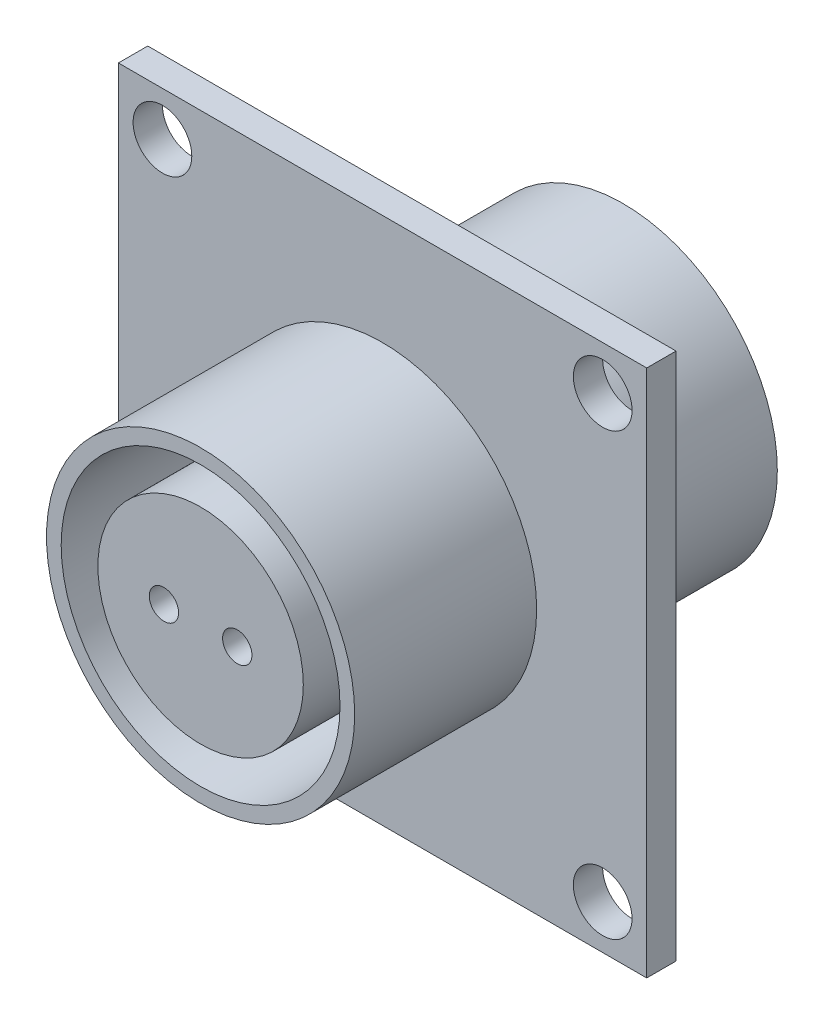
ISO-10303-21;
HEADER;
FILE_DESCRIPTION(('STEP AP214'),'2;1');
FILE_NAME('part.step','',(''),(''),'','','');
FILE_SCHEMA(('AUTOMOTIVE_DESIGN { 1 0 10303 214 1 1 1 1 }'));
ENDSEC;
DATA;
#1=APPLICATION_CONTEXT('core data for automotive mechanical design processes');
#2=APPLICATION_PROTOCOL_DEFINITION('international standard','automotive_design',2000,#1);
#3=PRODUCT_CONTEXT('',#1,'mechanical');
#4=PRODUCT('Part','Part','',(#3));
#5=PRODUCT_RELATED_PRODUCT_CATEGORY('part','',(#4));
#6=PRODUCT_DEFINITION_FORMATION('','',#4);
#7=PRODUCT_DEFINITION_CONTEXT('part definition',#1,'design');
#8=PRODUCT_DEFINITION('design','',#6,#7);
#9=PRODUCT_DEFINITION_SHAPE('','',#8);
#10=(LENGTH_UNIT() NAMED_UNIT(*) SI_UNIT(.MILLI.,.METRE.));
#11=(NAMED_UNIT(*) PLANE_ANGLE_UNIT() SI_UNIT($,.RADIAN.));
#12=(NAMED_UNIT(*) SI_UNIT($,.STERADIAN.) SOLID_ANGLE_UNIT());
#13=UNCERTAINTY_MEASURE_WITH_UNIT(LENGTH_MEASURE(1.E-05),#10,'distance_accuracy_value','');
#14=(GEOMETRIC_REPRESENTATION_CONTEXT(3) GLOBAL_UNCERTAINTY_ASSIGNED_CONTEXT((#13)) GLOBAL_UNIT_ASSIGNED_CONTEXT((#10,
#11,#12)) REPRESENTATION_CONTEXT('',''));
#15=CARTESIAN_POINT('',(0.,0.,0.));
#16=DIRECTION('',(0.,0.,1.));
#17=DIRECTION('',(1.,0.,0.));
#18=AXIS2_PLACEMENT_3D('',#15,#16,#17);
#19=CARTESIAN_POINT('',(15.,-15.,14.4));
#20=DIRECTION('',(0.,0.,1.));
#21=DIRECTION('',(1.,0.,0.));
#22=AXIS2_PLACEMENT_3D('',#19,#20,#21);
#23=PLANE('',#22);
#24=CARTESIAN_POINT('',(15.,-15.,14.4));
#25=DIRECTION('',(0.,0.,1.));
#26=DIRECTION('',(1.,0.,0.));
#27=AXIS2_PLACEMENT_3D('',#24,#25,#26);
#28=CIRCLE('',#27,7.);
#29=CARTESIAN_POINT('',(22.,-15.,14.4));
#30=VERTEX_POINT('',#29);
#31=EDGE_CURVE('E224',#30,#30,#28,.T.);
#32=ORIENTED_EDGE('',*,*,#31,.T.);
#33=EDGE_LOOP('',(#32));
#34=FACE_BOUND('',#33,.T.);
#35=CARTESIAN_POINT('',(17.5,-15.,14.4));
#36=DIRECTION('',(0.,0.,1.));
#37=DIRECTION('',(1.,0.,0.));
#38=AXIS2_PLACEMENT_3D('',#35,#36,#37);
#39=CIRCLE('',#38,1.);
#40=CARTESIAN_POINT('',(18.5,-15.,14.4));
#41=VERTEX_POINT('',#40);
#42=EDGE_CURVE('E229',#41,#41,#39,.T.);
#43=ORIENTED_EDGE('',*,*,#42,.F.);
#44=EDGE_LOOP('',(#43));
#45=FACE_BOUND('',#44,.T.);
#46=CARTESIAN_POINT('',(12.5,-15.,14.4));
#47=DIRECTION('',(0.,0.,1.));
#48=DIRECTION('',(1.,0.,0.));
#49=AXIS2_PLACEMENT_3D('',#46,#47,#48);
#50=CIRCLE('',#49,1.);
#51=CARTESIAN_POINT('',(13.5,-15.,14.4));
#52=VERTEX_POINT('',#51);
#53=EDGE_CURVE('E235',#52,#52,#50,.F.);
#54=ORIENTED_EDGE('',*,*,#53,.T.);
#55=EDGE_LOOP('',(#54));
#56=FACE_BOUND('',#55,.T.);
#57=ADVANCED_FACE('F49',(#34,#45,#56),#23,.T.);
#58=CARTESIAN_POINT('',(0.,0.,2.));
#59=DIRECTION('',(0.,0.,1.));
#60=DIRECTION('',(1.,0.,0.));
#61=AXIS2_PLACEMENT_3D('',#58,#59,#60);
#62=PLANE('',#61);
#63=CARTESIAN_POINT('',(15.,-15.,2.));
#64=DIRECTION('',(0.,0.,1.));
#65=DIRECTION('',(1.,0.,0.));
#66=AXIS2_PLACEMENT_3D('',#63,#64,#65);
#67=CIRCLE('',#66,10.5);
#68=CARTESIAN_POINT('',(25.5,-15.,2.));
#69=VERTEX_POINT('',#68);
#70=EDGE_CURVE('E12',#69,#69,#67,.T.);
#71=ORIENTED_EDGE('',*,*,#70,.F.);
#72=EDGE_LOOP('',(#71));
#73=FACE_BOUND('',#72,.T.);
#74=CARTESIAN_POINT('',(4.30211422042248E-13,-30.0000000000002,2.));
#75=DIRECTION('',(0.,0.,1.));
#76=DIRECTION('',(1.,0.,0.));
#77=AXIS2_PLACEMENT_3D('',#74,#75,#76);
#78=CIRCLE('',#77,2.);
#79=CARTESIAN_POINT('',(2.00000000000043,-30.0000000000002,2.));
#80=VERTEX_POINT('',#79);
#81=EDGE_CURVE('E151',#80,#80,#78,.T.);
#82=ORIENTED_EDGE('',*,*,#81,.F.);
#83=EDGE_LOOP('',(#82));
#84=FACE_BOUND('',#83,.T.);
#85=CARTESIAN_POINT('',(30.0000000000001,0.,2.));
#86=DIRECTION('',(0.,0.,1.));
#87=DIRECTION('',(1.,0.,0.));
#88=AXIS2_PLACEMENT_3D('',#85,#86,#87);
#89=CIRCLE('',#88,2.);
#90=CARTESIAN_POINT('',(32.0000000000001,0.,2.));
#91=VERTEX_POINT('',#90);
#92=EDGE_CURVE('E122',#91,#91,#89,.T.);
#93=ORIENTED_EDGE('',*,*,#92,.F.);
#94=EDGE_LOOP('',(#93));
#95=FACE_BOUND('',#94,.T.);
#96=DIRECTION('',(0.,-1.,0.));
#97=VECTOR('',#96,1.);
#98=CARTESIAN_POINT('',(-3.,3.,2.));
#99=LINE('',#98,#97);
#100=CARTESIAN_POINT('',(-3.,3.,2.));
#101=VERTEX_POINT('',#100);
#102=CARTESIAN_POINT('',(-3.,-33.,2.));
#103=VERTEX_POINT('',#102);
#104=EDGE_CURVE('E105',#101,#103,#99,.T.);
#105=ORIENTED_EDGE('',*,*,#104,.T.);
#106=DIRECTION('',(1.,0.,0.));
#107=VECTOR('',#106,1.);
#108=CARTESIAN_POINT('',(-3.,-33.,2.));
#109=LINE('',#108,#107);
#110=CARTESIAN_POINT('',(33.,-33.,2.));
#111=VERTEX_POINT('',#110);
#112=EDGE_CURVE('E99',#103,#111,#109,.T.);
#113=ORIENTED_EDGE('',*,*,#112,.T.);
#114=DIRECTION('',(0.,1.,0.));
#115=VECTOR('',#114,1.);
#116=CARTESIAN_POINT('',(33.,3.,2.));
#117=LINE('',#116,#115);
#118=CARTESIAN_POINT('',(33.,3.,2.));
#119=VERTEX_POINT('',#118);
#120=EDGE_CURVE('E103',#111,#119,#117,.T.);
#121=ORIENTED_EDGE('',*,*,#120,.T.);
#122=DIRECTION('',(-1.,0.,0.));
#123=VECTOR('',#122,1.);
#124=CARTESIAN_POINT('',(-3.,3.,2.));
#125=LINE('',#124,#123);
#126=EDGE_CURVE('E68',#119,#101,#125,.T.);
#127=ORIENTED_EDGE('',*,*,#126,.T.);
#128=EDGE_LOOP('',(#105,#113,#121,#127));
#129=FACE_BOUND('',#128,.T.);
#130=CARTESIAN_POINT('',(1.14491749414469E-13,-2.09488880330588E-13,2.));
#131=DIRECTION('',(0.,0.,1.));
#132=DIRECTION('',(1.,0.,0.));
#133=AXIS2_PLACEMENT_3D('',#130,#131,#132);
#134=CIRCLE('',#133,2.);
#135=CARTESIAN_POINT('',(2.00000000000011,-2.09488880330588E-13,2.));
#136=VERTEX_POINT('',#135);
#137=EDGE_CURVE('E156',#136,#136,#134,.T.);
#138=ORIENTED_EDGE('',*,*,#137,.F.);
#139=EDGE_LOOP('',(#138));
#140=FACE_BOUND('',#139,.T.);
#141=CARTESIAN_POINT('',(30.0000000000004,-30.,2.));
#142=DIRECTION('',(0.,0.,1.));
#143=DIRECTION('',(1.,0.,0.));
#144=AXIS2_PLACEMENT_3D('',#141,#142,#143);
#145=CIRCLE('',#144,2.);
#146=CARTESIAN_POINT('',(32.0000000000004,-30.,2.));
#147=VERTEX_POINT('',#146);
#148=EDGE_CURVE('E143',#147,#147,#145,.T.);
#149=ORIENTED_EDGE('',*,*,#148,.F.);
#150=EDGE_LOOP('',(#149));
#151=FACE_BOUND('',#150,.T.);
#152=ADVANCED_FACE('F100',(#73,#84,#95,#129,#140,#151),#62,.T.);
#153=CARTESIAN_POINT('',(0.,0.,0.));
#154=DIRECTION('',(0.,0.,1.));
#155=DIRECTION('',(1.,0.,0.));
#156=AXIS2_PLACEMENT_3D('',#153,#154,#155);
#157=PLANE('',#156);
#158=CARTESIAN_POINT('',(15.,-15.,0.));
#159=DIRECTION('',(0.,0.,1.));
#160=DIRECTION('',(1.,0.,0.));
#161=AXIS2_PLACEMENT_3D('',#158,#159,#160);
#162=CIRCLE('',#161,10.5);
#163=CARTESIAN_POINT('',(25.5,-15.,0.));
#164=VERTEX_POINT('',#163);
#165=EDGE_CURVE('E53',#164,#164,#162,.T.);
#166=ORIENTED_EDGE('',*,*,#165,.T.);
#167=EDGE_LOOP('',(#166));
#168=FACE_BOUND('',#167,.T.);
#169=CARTESIAN_POINT('',(4.30211422042248E-13,-30.0000000000002,0.));
#170=DIRECTION('',(0.,0.,1.));
#171=DIRECTION('',(1.,0.,0.));
#172=AXIS2_PLACEMENT_3D('',#169,#170,#171);
#173=CIRCLE('',#172,2.);
#174=CARTESIAN_POINT('',(2.00000000000043,-30.0000000000002,0.));
#175=VERTEX_POINT('',#174);
#176=EDGE_CURVE('E146',#175,#175,#173,.T.);
#177=ORIENTED_EDGE('',*,*,#176,.T.);
#178=EDGE_LOOP('',(#177));
#179=FACE_BOUND('',#178,.T.);
#180=CARTESIAN_POINT('',(30.0000000000001,0.,0.));
#181=DIRECTION('',(0.,0.,1.));
#182=DIRECTION('',(1.,0.,0.));
#183=AXIS2_PLACEMENT_3D('',#180,#181,#182);
#184=CIRCLE('',#183,2.);
#185=CARTESIAN_POINT('',(32.0000000000001,0.,0.));
#186=VERTEX_POINT('',#185);
#187=EDGE_CURVE('E159',#186,#186,#184,.T.);
#188=ORIENTED_EDGE('',*,*,#187,.T.);
#189=EDGE_LOOP('',(#188));
#190=FACE_BOUND('',#189,.T.);
#191=DIRECTION('',(0.,-1.,0.));
#192=VECTOR('',#191,1.);
#193=CARTESIAN_POINT('',(-3.,3.,0.));
#194=LINE('',#193,#192);
#195=CARTESIAN_POINT('',(-3.,3.,0.));
#196=VERTEX_POINT('',#195);
#197=CARTESIAN_POINT('',(-3.,-33.,0.));
#198=VERTEX_POINT('',#197);
#199=EDGE_CURVE('E119',#196,#198,#194,.T.);
#200=ORIENTED_EDGE('',*,*,#199,.F.);
#201=DIRECTION('',(-1.,0.,0.));
#202=VECTOR('',#201,1.);
#203=CARTESIAN_POINT('',(-3.,3.,0.));
#204=LINE('',#203,#202);
#205=CARTESIAN_POINT('',(33.,3.,0.));
#206=VERTEX_POINT('',#205);
#207=EDGE_CURVE('E91',#206,#196,#204,.T.);
#208=ORIENTED_EDGE('',*,*,#207,.F.);
#209=DIRECTION('',(0.,1.,0.));
#210=VECTOR('',#209,1.);
#211=CARTESIAN_POINT('',(33.,3.,0.));
#212=LINE('',#211,#210);
#213=CARTESIAN_POINT('',(33.,-33.,0.));
#214=VERTEX_POINT('',#213);
#215=EDGE_CURVE('E85',#214,#206,#212,.T.);
#216=ORIENTED_EDGE('',*,*,#215,.F.);
#217=DIRECTION('',(1.,0.,0.));
#218=VECTOR('',#217,1.);
#219=CARTESIAN_POINT('',(-3.,-33.,0.));
#220=LINE('',#219,#218);
#221=EDGE_CURVE('E110',#198,#214,#220,.T.);
#222=ORIENTED_EDGE('',*,*,#221,.F.);
#223=EDGE_LOOP('',(#200,#208,#216,#222));
#224=FACE_BOUND('',#223,.T.);
#225=CARTESIAN_POINT('',(1.14491749414469E-13,-2.09488880330588E-13,0.));
#226=DIRECTION('',(0.,0.,1.));
#227=DIRECTION('',(1.,0.,0.));
#228=AXIS2_PLACEMENT_3D('',#225,#226,#227);
#229=CIRCLE('',#228,2.);
#230=CARTESIAN_POINT('',(2.00000000000011,-2.09488880330588E-13,0.));
#231=VERTEX_POINT('',#230);
#232=EDGE_CURVE('E138',#231,#231,#229,.T.);
#233=ORIENTED_EDGE('',*,*,#232,.T.);
#234=EDGE_LOOP('',(#233));
#235=FACE_BOUND('',#234,.T.);
#236=CARTESIAN_POINT('',(30.0000000000004,-30.,0.));
#237=DIRECTION('',(0.,0.,1.));
#238=DIRECTION('',(1.,0.,0.));
#239=AXIS2_PLACEMENT_3D('',#236,#237,#238);
#240=CIRCLE('',#239,2.);
#241=CARTESIAN_POINT('',(32.0000000000004,-30.,0.));
#242=VERTEX_POINT('',#241);
#243=EDGE_CURVE('E141',#242,#242,#240,.T.);
#244=ORIENTED_EDGE('',*,*,#243,.T.);
#245=EDGE_LOOP('',(#244));
#246=FACE_BOUND('',#245,.T.);
#247=ADVANCED_FACE('F130',(#168,#179,#190,#224,#235,#246),#157,.F.);
#248=CARTESIAN_POINT('',(-3.,3.,2.));
#249=DIRECTION('',(1.,0.,0.));
#250=DIRECTION('',(0.,0.,-1.));
#251=AXIS2_PLACEMENT_3D('',#248,#249,#250);
#252=PLANE('',#251);
#253=ORIENTED_EDGE('',*,*,#199,.T.);
#254=DIRECTION('',(0.,0.,-1.));
#255=VECTOR('',#254,1.);
#256=CARTESIAN_POINT('',(-3.,-33.,2.));
#257=LINE('',#256,#255);
#258=EDGE_CURVE('E59',#103,#198,#257,.T.);
#259=ORIENTED_EDGE('',*,*,#258,.F.);
#260=ORIENTED_EDGE('',*,*,#104,.F.);
#261=DIRECTION('',(0.,0.,-1.));
#262=VECTOR('',#261,1.);
#263=CARTESIAN_POINT('',(-3.,3.,2.));
#264=LINE('',#263,#262);
#265=EDGE_CURVE('E115',#101,#196,#264,.T.);
#266=ORIENTED_EDGE('',*,*,#265,.T.);
#267=EDGE_LOOP('',(#253,#259,#260,#266));
#268=FACE_BOUND('',#267,.T.);
#269=ADVANCED_FACE('F51',(#268),#252,.F.);
#270=CARTESIAN_POINT('',(-3.,-33.,2.));
#271=DIRECTION('',(0.,1.,0.));
#272=DIRECTION('',(0.,0.,1.));
#273=AXIS2_PLACEMENT_3D('',#270,#271,#272);
#274=PLANE('',#273);
#275=ORIENTED_EDGE('',*,*,#221,.T.);
#276=DIRECTION('',(0.,0.,-1.));
#277=VECTOR('',#276,1.);
#278=CARTESIAN_POINT('',(33.,-33.,2.));
#279=LINE('',#278,#277);
#280=EDGE_CURVE('E108',#111,#214,#279,.T.);
#281=ORIENTED_EDGE('',*,*,#280,.F.);
#282=ORIENTED_EDGE('',*,*,#112,.F.);
#283=ORIENTED_EDGE('',*,*,#258,.T.);
#284=EDGE_LOOP('',(#275,#281,#282,#283));
#285=FACE_BOUND('',#284,.T.);
#286=ADVANCED_FACE('F109',(#285),#274,.F.);
#287=CARTESIAN_POINT('',(33.,3.,2.));
#288=DIRECTION('',(-1.,0.,0.));
#289=DIRECTION('',(0.,0.,1.));
#290=AXIS2_PLACEMENT_3D('',#287,#288,#289);
#291=PLANE('',#290);
#292=ORIENTED_EDGE('',*,*,#215,.T.);
#293=DIRECTION('',(0.,0.,-1.));
#294=VECTOR('',#293,1.);
#295=CARTESIAN_POINT('',(33.,3.,2.));
#296=LINE('',#295,#294);
#297=EDGE_CURVE('E111',#119,#206,#296,.T.);
#298=ORIENTED_EDGE('',*,*,#297,.F.);
#299=ORIENTED_EDGE('',*,*,#120,.F.);
#300=ORIENTED_EDGE('',*,*,#280,.T.);
#301=EDGE_LOOP('',(#292,#298,#299,#300));
#302=FACE_BOUND('',#301,.T.);
#303=ADVANCED_FACE('F113',(#302),#291,.F.);
#304=CARTESIAN_POINT('',(-3.,3.,2.));
#305=DIRECTION('',(0.,-1.,0.));
#306=DIRECTION('',(0.,0.,-1.));
#307=AXIS2_PLACEMENT_3D('',#304,#305,#306);
#308=PLANE('',#307);
#309=ORIENTED_EDGE('',*,*,#207,.T.);
#310=ORIENTED_EDGE('',*,*,#265,.F.);
#311=ORIENTED_EDGE('',*,*,#126,.F.);
#312=ORIENTED_EDGE('',*,*,#297,.T.);
#313=EDGE_LOOP('',(#309,#310,#311,#312));
#314=FACE_BOUND('',#313,.T.);
#315=ADVANCED_FACE('F170',(#314),#308,.F.);
#316=CARTESIAN_POINT('',(30.0000000000001,0.,2.));
#317=DIRECTION('',(0.,0.,-1.));
#318=DIRECTION('',(-1.,0.,0.));
#319=AXIS2_PLACEMENT_3D('',#316,#317,#318);
#320=CYLINDRICAL_SURFACE('',#319,2.);
#321=ORIENTED_EDGE('',*,*,#92,.T.);
#322=EDGE_LOOP('',(#321));
#323=FACE_BOUND('',#322,.T.);
#324=ORIENTED_EDGE('',*,*,#187,.F.);
#325=EDGE_LOOP('',(#324));
#326=FACE_BOUND('',#325,.T.);
#327=ADVANCED_FACE('F167',(#323,#326),#320,.F.);
#328=CARTESIAN_POINT('',(1.14491749414469E-13,-2.09488880330588E-13,2.));
#329=DIRECTION('',(0.,0.,-1.));
#330=DIRECTION('',(-1.,0.,0.));
#331=AXIS2_PLACEMENT_3D('',#328,#329,#330);
#332=CYLINDRICAL_SURFACE('',#331,2.);
#333=ORIENTED_EDGE('',*,*,#137,.T.);
#334=EDGE_LOOP('',(#333));
#335=FACE_BOUND('',#334,.T.);
#336=ORIENTED_EDGE('',*,*,#232,.F.);
#337=EDGE_LOOP('',(#336));
#338=FACE_BOUND('',#337,.T.);
#339=ADVANCED_FACE('F169',(#335,#338),#332,.F.);
#340=CARTESIAN_POINT('',(4.30211422042248E-13,-30.0000000000002,2.));
#341=DIRECTION('',(0.,0.,-1.));
#342=DIRECTION('',(-1.,0.,0.));
#343=AXIS2_PLACEMENT_3D('',#340,#341,#342);
#344=CYLINDRICAL_SURFACE('',#343,2.);
#345=ORIENTED_EDGE('',*,*,#81,.T.);
#346=EDGE_LOOP('',(#345));
#347=FACE_BOUND('',#346,.T.);
#348=ORIENTED_EDGE('',*,*,#176,.F.);
#349=EDGE_LOOP('',(#348));
#350=FACE_BOUND('',#349,.T.);
#351=ADVANCED_FACE('F177',(#347,#350),#344,.F.);
#352=CARTESIAN_POINT('',(30.0000000000004,-30.,2.));
#353=DIRECTION('',(0.,0.,-1.));
#354=DIRECTION('',(-1.,0.,0.));
#355=AXIS2_PLACEMENT_3D('',#352,#353,#354);
#356=CYLINDRICAL_SURFACE('',#355,2.);
#357=ORIENTED_EDGE('',*,*,#148,.T.);
#358=EDGE_LOOP('',(#357));
#359=FACE_BOUND('',#358,.T.);
#360=ORIENTED_EDGE('',*,*,#243,.F.);
#361=EDGE_LOOP('',(#360));
#362=FACE_BOUND('',#361,.T.);
#363=ADVANCED_FACE('F338',(#359,#362),#356,.F.);
#364=CARTESIAN_POINT('',(15.,-15.,-14.4));
#365=DIRECTION('',(0.,0.,1.));
#366=DIRECTION('',(1.,0.,0.));
#367=AXIS2_PLACEMENT_3D('',#364,#365,#366);
#368=PLANE('',#367);
#369=CARTESIAN_POINT('',(15.,-15.,-14.4));
#370=DIRECTION('',(0.,0.,1.));
#371=DIRECTION('',(1.,0.,0.));
#372=AXIS2_PLACEMENT_3D('',#369,#370,#371);
#373=CIRCLE('',#372,10.5);
#374=CARTESIAN_POINT('',(25.5,-15.,-14.4));
#375=VERTEX_POINT('',#374);
#376=EDGE_CURVE('E149',#375,#375,#373,.T.);
#377=ORIENTED_EDGE('',*,*,#376,.F.);
#378=EDGE_LOOP('',(#377));
#379=FACE_BOUND('',#378,.T.);
#380=ADVANCED_FACE('F330',(#379),#368,.F.);
#381=CARTESIAN_POINT('',(15.,-15.,-14.4));
#382=DIRECTION('',(0.,0.,1.));
#383=DIRECTION('',(1.,0.,0.));
#384=AXIS2_PLACEMENT_3D('',#381,#382,#383);
#385=CYLINDRICAL_SURFACE('',#384,10.5);
#386=ORIENTED_EDGE('',*,*,#376,.T.);
#387=EDGE_LOOP('',(#386));
#388=FACE_BOUND('',#387,.T.);
#389=ORIENTED_EDGE('',*,*,#165,.F.);
#390=EDGE_LOOP('',(#389));
#391=FACE_BOUND('',#390,.T.);
#392=ADVANCED_FACE('F204',(#388,#391),#385,.T.);
#393=ORIENTED_EDGE('',*,*,#70,.T.);
#394=EDGE_LOOP('',(#393));
#395=FACE_BOUND('',#394,.T.);
#396=CARTESIAN_POINT('',(15.,-15.,14.4));
#397=DIRECTION('',(0.,0.,1.));
#398=DIRECTION('',(1.,0.,0.));
#399=AXIS2_PLACEMENT_3D('',#396,#397,#398);
#400=CIRCLE('',#399,10.5);
#401=CARTESIAN_POINT('',(25.5,-15.,14.4));
#402=VERTEX_POINT('',#401);
#403=EDGE_CURVE('E213',#402,#402,#400,.T.);
#404=ORIENTED_EDGE('',*,*,#403,.F.);
#405=EDGE_LOOP('',(#404));
#406=FACE_BOUND('',#405,.T.);
#407=ADVANCED_FACE('F196',(#395,#406),#385,.T.);
#408=CARTESIAN_POINT('',(15.,-15.,14.4));
#409=DIRECTION('',(0.,0.,1.));
#410=DIRECTION('',(1.,0.,0.));
#411=AXIS2_PLACEMENT_3D('',#408,#409,#410);
#412=CIRCLE('',#411,9.5);
#413=CARTESIAN_POINT('',(24.5,-15.,14.4));
#414=VERTEX_POINT('',#413);
#415=EDGE_CURVE('E210',#414,#414,#412,.T.);
#416=ORIENTED_EDGE('',*,*,#415,.F.);
#417=EDGE_LOOP('',(#416));
#418=FACE_BOUND('',#417,.T.);
#419=ORIENTED_EDGE('',*,*,#403,.T.);
#420=EDGE_LOOP('',(#419));
#421=FACE_BOUND('',#420,.T.);
#422=ADVANCED_FACE('F185',(#418,#421),#23,.T.);
#423=CARTESIAN_POINT('',(15.,-15.,4.4));
#424=DIRECTION('',(0.,0.,1.));
#425=DIRECTION('',(1.,0.,0.));
#426=AXIS2_PLACEMENT_3D('',#423,#424,#425);
#427=CYLINDRICAL_SURFACE('',#426,7.);
#428=CARTESIAN_POINT('',(15.,-15.,4.4));
#429=DIRECTION('',(0.,0.,1.));
#430=DIRECTION('',(1.,0.,0.));
#431=AXIS2_PLACEMENT_3D('',#428,#429,#430);
#432=CIRCLE('',#431,7.);
#433=CARTESIAN_POINT('',(22.,-15.,4.4));
#434=VERTEX_POINT('',#433);
#435=EDGE_CURVE('E220',#434,#434,#432,.T.);
#436=ORIENTED_EDGE('',*,*,#435,.T.);
#437=EDGE_LOOP('',(#436));
#438=FACE_BOUND('',#437,.T.);
#439=ORIENTED_EDGE('',*,*,#31,.F.);
#440=EDGE_LOOP('',(#439));
#441=FACE_BOUND('',#440,.T.);
#442=ADVANCED_FACE('F195',(#438,#441),#427,.T.);
#443=CARTESIAN_POINT('',(15.,-15.,4.4));
#444=DIRECTION('',(0.,0.,1.));
#445=DIRECTION('',(1.,0.,0.));
#446=AXIS2_PLACEMENT_3D('',#443,#444,#445);
#447=CYLINDRICAL_SURFACE('',#446,9.5);
#448=CARTESIAN_POINT('',(15.,-15.,4.4));
#449=DIRECTION('',(0.,0.,1.));
#450=DIRECTION('',(1.,0.,0.));
#451=AXIS2_PLACEMENT_3D('',#448,#449,#450);
#452=CIRCLE('',#451,9.5);
#453=CARTESIAN_POINT('',(24.5,-15.,4.4));
#454=VERTEX_POINT('',#453);
#455=EDGE_CURVE('E215',#454,#454,#452,.T.);
#456=ORIENTED_EDGE('',*,*,#455,.F.);
#457=EDGE_LOOP('',(#456));
#458=FACE_BOUND('',#457,.T.);
#459=ORIENTED_EDGE('',*,*,#415,.T.);
#460=EDGE_LOOP('',(#459));
#461=FACE_BOUND('',#460,.T.);
#462=ADVANCED_FACE('F202',(#458,#461),#447,.F.);
#463=CARTESIAN_POINT('',(0.,0.,4.4));
#464=DIRECTION('',(0.,0.,1.));
#465=DIRECTION('',(1.,0.,0.));
#466=AXIS2_PLACEMENT_3D('',#463,#464,#465);
#467=PLANE('',#466);
#468=ORIENTED_EDGE('',*,*,#435,.F.);
#469=EDGE_LOOP('',(#468));
#470=FACE_BOUND('',#469,.T.);
#471=ORIENTED_EDGE('',*,*,#455,.T.);
#472=EDGE_LOOP('',(#471));
#473=FACE_BOUND('',#472,.T.);
#474=ADVANCED_FACE('F259',(#470,#473),#467,.T.);
#475=CARTESIAN_POINT('',(17.5,-15.,4.4));
#476=DIRECTION('',(0.,0.,1.));
#477=DIRECTION('',(1.,0.,0.));
#478=AXIS2_PLACEMENT_3D('',#475,#476,#477);
#479=CYLINDRICAL_SURFACE('',#478,1.);
#480=CARTESIAN_POINT('',(17.5,-15.,4.4));
#481=DIRECTION('',(0.,0.,1.));
#482=DIRECTION('',(1.,0.,0.));
#483=AXIS2_PLACEMENT_3D('',#480,#481,#482);
#484=CIRCLE('',#483,1.);
#485=CARTESIAN_POINT('',(18.5,-15.,4.4));
#486=VERTEX_POINT('',#485);
#487=EDGE_CURVE('E225',#486,#486,#484,.T.);
#488=ORIENTED_EDGE('',*,*,#487,.F.);
#489=EDGE_LOOP('',(#488));
#490=FACE_BOUND('',#489,.T.);
#491=ORIENTED_EDGE('',*,*,#42,.T.);
#492=EDGE_LOOP('',(#491));
#493=FACE_BOUND('',#492,.T.);
#494=ADVANCED_FACE('F255',(#490,#493),#479,.F.);
#495=CARTESIAN_POINT('',(0.,0.,4.4));
#496=DIRECTION('',(0.,0.,1.));
#497=DIRECTION('',(1.,0.,0.));
#498=AXIS2_PLACEMENT_3D('',#495,#496,#497);
#499=PLANE('',#498);
#500=ORIENTED_EDGE('',*,*,#487,.T.);
#501=EDGE_LOOP('',(#500));
#502=FACE_BOUND('',#501,.T.);
#503=ADVANCED_FACE('F250',(#502),#499,.T.);
#504=CARTESIAN_POINT('',(12.5,-15.,4.4));
#505=DIRECTION('',(0.,0.,1.));
#506=DIRECTION('',(1.,0.,0.));
#507=AXIS2_PLACEMENT_3D('',#504,#505,#506);
#508=CYLINDRICAL_SURFACE('',#507,1.);
#509=CARTESIAN_POINT('',(12.5,-15.,4.4));
#510=DIRECTION('',(0.,0.,1.));
#511=DIRECTION('',(1.,0.,0.));
#512=AXIS2_PLACEMENT_3D('',#509,#510,#511);
#513=CIRCLE('',#512,1.);
#514=CARTESIAN_POINT('',(13.5,-15.,4.4));
#515=VERTEX_POINT('',#514);
#516=EDGE_CURVE('E232',#515,#515,#513,.F.);
#517=ORIENTED_EDGE('',*,*,#516,.T.);
#518=EDGE_LOOP('',(#517));
#519=FACE_BOUND('',#518,.T.);
#520=ORIENTED_EDGE('',*,*,#53,.F.);
#521=EDGE_LOOP('',(#520));
#522=FACE_BOUND('',#521,.T.);
#523=ADVANCED_FACE('F241',(#519,#522),#508,.F.);
#524=CARTESIAN_POINT('',(0.,0.,4.4));
#525=DIRECTION('',(0.,0.,1.));
#526=DIRECTION('',(1.,0.,0.));
#527=AXIS2_PLACEMENT_3D('',#524,#525,#526);
#528=PLANE('',#527);
#529=ORIENTED_EDGE('',*,*,#516,.F.);
#530=EDGE_LOOP('',(#529));
#531=FACE_BOUND('',#530,.T.);
#532=ADVANCED_FACE('F244',(#531),#528,.T.);
#533=CLOSED_SHELL('',(#57,#152,#247,#269,#286,#303,#315,#327,#339,#351,#363,#380,#392,#407,#422,
#442,#462,#474,#494,#503,#523,#532));
#534=MANIFOLD_SOLID_BREP('B2',#533);
#535=ADVANCED_BREP_SHAPE_REPRESENTATION('',(#18,#534),#14);
#536=SHAPE_DEFINITION_REPRESENTATION(#9,#535);
ENDSEC;
END-ISO-10303-21;
